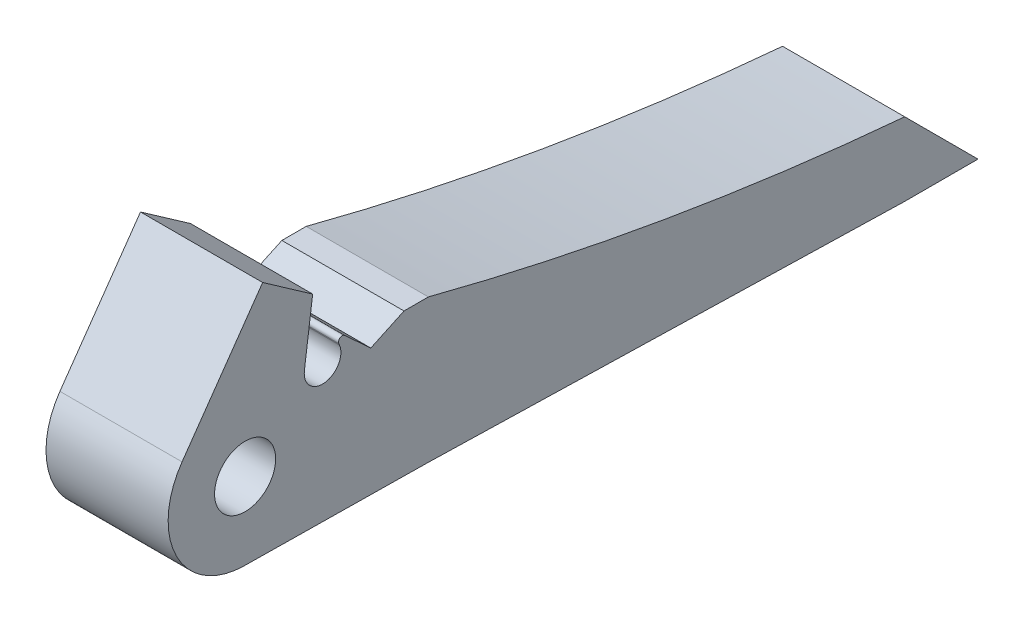
ISO-10303-21;
HEADER;
FILE_DESCRIPTION(('STEP AP214'),'2;1');
FILE_NAME('part.step','',(''),(''),'','','');
FILE_SCHEMA(('AUTOMOTIVE_DESIGN { 1 0 10303 214 1 1 1 1 }'));
ENDSEC;
DATA;
#1=APPLICATION_CONTEXT('core data for automotive mechanical design processes');
#2=APPLICATION_PROTOCOL_DEFINITION('international standard','automotive_design',2000,#1);
#3=PRODUCT_CONTEXT('',#1,'mechanical');
#4=PRODUCT('Part','Part','',(#3));
#5=PRODUCT_RELATED_PRODUCT_CATEGORY('part','',(#4));
#6=PRODUCT_DEFINITION_FORMATION('','',#4);
#7=PRODUCT_DEFINITION_CONTEXT('part definition',#1,'design');
#8=PRODUCT_DEFINITION('design','',#6,#7);
#9=PRODUCT_DEFINITION_SHAPE('','',#8);
#10=(LENGTH_UNIT() NAMED_UNIT(*) SI_UNIT(.MILLI.,.METRE.));
#11=(NAMED_UNIT(*) PLANE_ANGLE_UNIT() SI_UNIT($,.RADIAN.));
#12=(NAMED_UNIT(*) SI_UNIT($,.STERADIAN.) SOLID_ANGLE_UNIT());
#13=UNCERTAINTY_MEASURE_WITH_UNIT(LENGTH_MEASURE(1.E-05),#10,'distance_accuracy_value','');
#14=(GEOMETRIC_REPRESENTATION_CONTEXT(3) GLOBAL_UNCERTAINTY_ASSIGNED_CONTEXT((#13)) GLOBAL_UNIT_ASSIGNED_CONTEXT((#10,
#11,#12)) REPRESENTATION_CONTEXT('',''));
#15=CARTESIAN_POINT('',(0.,0.,0.));
#16=DIRECTION('',(0.,0.,1.));
#17=DIRECTION('',(1.,0.,0.));
#18=AXIS2_PLACEMENT_3D('',#15,#16,#17);
#19=CARTESIAN_POINT('',(6.35,9.525,-176.47164647412));
#20=DIRECTION('',(1.,0.,0.));
#21=DIRECTION('',(0.,0.,-1.));
#22=AXIS2_PLACEMENT_3D('',#19,#20,#21);
#23=PLANE('',#22);
#24=DIRECTION('',(0.,0.675997213115525,0.736904178207753));
#25=VECTOR('',#24,1.);
#26=CARTESIAN_POINT('',(6.35,14.5548502284291,-189.540378321137));
#27=LINE('',#26,#25);
#28=CARTESIAN_POINT('',(6.35,14.5548502284291,-189.540378321137));
#29=VERTEX_POINT('',#28);
#30=CARTESIAN_POINT('',(6.35,17.0473052344059,-186.823354534258));
#31=VERTEX_POINT('',#30);
#32=EDGE_CURVE('E200',#29,#31,#27,.T.);
#33=ORIENTED_EDGE('',*,*,#32,.T.);
#34=CARTESIAN_POINT('',(6.35,16.7665447425088,-186.565799596061));
#35=DIRECTION('',(1.,0.,0.));
#36=DIRECTION('',(0.,0.,-1.));
#37=AXIS2_PLACEMENT_3D('',#34,#35,#36);
#38=CIRCLE('',#37,0.381);
#39=CARTESIAN_POINT('',(6.35,16.6212011416768,-186.213611808514));
#40=VERTEX_POINT('',#39);
#41=EDGE_CURVE('E11',#31,#40,#38,.T.);
#42=ORIENTED_EDGE('',*,*,#41,.T.);
#43=DIRECTION('',(0.,-0.924377395136282,-0.381479267275513));
#44=VECTOR('',#43,1.);
#45=CARTESIAN_POINT('',(6.35,18.206999928397,-185.559172006775));
#46=LINE('',#45,#44);
#47=CARTESIAN_POINT('',(6.35,16.4460609906623,-186.285890010935));
#48=VERTEX_POINT('',#47);
#49=EDGE_CURVE('E202',#40,#48,#46,.T.);
#50=ORIENTED_EDGE('',*,*,#49,.T.);
#51=CARTESIAN_POINT('',(6.35,15.7193429865025,-184.524951073201));
#52=DIRECTION('',(-1.,0.,0.));
#53=DIRECTION('',(0.,0.,1.));
#54=AXIS2_PLACEMENT_3D('',#51,#52,#53);
#55=CIRCLE('',#54,1.905);
#56=CARTESIAN_POINT('',(6.35,15.9704562023799,-182.636574216529));
#57=VERTEX_POINT('',#56);
#58=EDGE_CURVE('E204',#48,#57,#55,.T.);
#59=ORIENTED_EDGE('',*,*,#58,.T.);
#60=DIRECTION('',(0.,0.991273940509862,-0.131817961090479));
#61=VECTOR('',#60,1.);
#62=CARTESIAN_POINT('',(6.35,15.9704562023799,-182.636574216529));
#63=LINE('',#62,#61);
#64=CARTESIAN_POINT('',(6.35,22.4356903032563,-183.496310301906));
#65=VERTEX_POINT('',#64);
#66=EDGE_CURVE('E206',#57,#65,#63,.T.);
#67=ORIENTED_EDGE('',*,*,#66,.T.);
#68=DIRECTION('',(0.,0.573576436351047,0.819152044288991));
#69=VECTOR('',#68,1.);
#70=CARTESIAN_POINT('',(6.35,26.0779006740854,-178.294694820671));
#71=LINE('',#70,#69);
#72=CARTESIAN_POINT('',(6.35,26.0779006740854,-178.294694820671));
#73=VERTEX_POINT('',#72);
#74=EDGE_CURVE('E208',#65,#73,#71,.T.);
#75=ORIENTED_EDGE('',*,*,#74,.T.);
#76=DIRECTION('',(0.,-0.819152044288991,0.573576436351048));
#77=VECTOR('',#76,1.);
#78=CARTESIAN_POINT('',(6.35,14.1141850672447,-169.917610967764));
#79=LINE('',#78,#77);
#80=CARTESIAN_POINT('',(6.35,14.1141850672447,-169.917610967764));
#81=VERTEX_POINT('',#80);
#82=EDGE_CURVE('E210',#73,#81,#79,.T.);
#83=ORIENTED_EDGE('',*,*,#82,.T.);
#84=CARTESIAN_POINT('',(6.35,9.525,-176.47164647412));
#85=DIRECTION('',(1.,0.,0.));
#86=DIRECTION('',(0.,0.,-1.));
#87=AXIS2_PLACEMENT_3D('',#84,#85,#86);
#88=CIRCLE('',#87,8.00100000000001);
#89=CARTESIAN_POINT('',(6.35,1.52470715135464,-176.365272906379));
#90=VERTEX_POINT('',#89);
#91=EDGE_CURVE('E192',#81,#90,#88,.T.);
#92=ORIENTED_EDGE('',*,*,#91,.T.);
#93=DIRECTION('',(0.,-0.0132950340883751,-0.999911617128528));
#94=VECTOR('',#93,1.);
#95=CARTESIAN_POINT('',(6.35,1.27000000001228,-195.521646474134));
#96=LINE('',#95,#94);
#97=CARTESIAN_POINT('',(6.35,1.27000000001228,-195.521646474134));
#98=VERTEX_POINT('',#97);
#99=EDGE_CURVE('E172',#90,#98,#96,.T.);
#100=ORIENTED_EDGE('',*,*,#99,.T.);
#101=DIRECTION('',(0.,-0.0256326007925578,-0.999671430909481));
#102=VECTOR('',#101,1.);
#103=CARTESIAN_POINT('',(6.35,1.27000000001228,-195.521646474134));
#104=LINE('',#103,#102);
#105=CARTESIAN_POINT('',(6.35,1.22757706777499E-11,-245.051646474121));
#106=VERTEX_POINT('',#105);
#107=EDGE_CURVE('E154',#98,#106,#104,.T.);
#108=ORIENTED_EDGE('',*,*,#107,.T.);
#109=DIRECTION('',(0.,0.,-1.));
#110=VECTOR('',#109,1.);
#111=CARTESIAN_POINT('',(6.35,1.22757706777499E-11,-245.051646474121));
#112=LINE('',#111,#110);
#113=CARTESIAN_POINT('',(6.35,1.22755538373154E-11,-252.67164647412));
#114=VERTEX_POINT('',#113);
#115=EDGE_CURVE('E163',#106,#114,#112,.T.);
#116=ORIENTED_EDGE('',*,*,#115,.T.);
#117=DIRECTION('',(0.,0.707106781186549,0.707106781186546));
#118=VECTOR('',#117,1.);
#119=CARTESIAN_POINT('',(6.35,7.62000000001227,-245.051646474121));
#120=LINE('',#119,#118);
#121=CARTESIAN_POINT('',(6.35,7.62000000001227,-245.051646474121));
#122=VERTEX_POINT('',#121);
#123=EDGE_CURVE('E160',#114,#122,#120,.T.);
#124=ORIENTED_EDGE('',*,*,#123,.T.);
#125=CARTESIAN_POINT('',(6.35,307.526330887618,-271.290050546441));
#126=DIRECTION('',(-1.,0.,0.));
#127=DIRECTION('',(0.,0.,-1.));
#128=AXIS2_PLACEMENT_3D('',#125,#126,#127);
#129=CIRCLE('',#128,301.051924349818);
#130=CARTESIAN_POINT('',(6.35,16.1650258056597,-195.52164647412));
#131=VERTEX_POINT('',#130);
#132=EDGE_CURVE('E174',#122,#131,#129,.T.);
#133=ORIENTED_EDGE('',*,*,#132,.T.);
#134=DIRECTION('',(0.,4.5834151490827E-13,1.));
#135=VECTOR('',#134,1.);
#136=CARTESIAN_POINT('',(6.35,16.1650258056608,-192.993410989747));
#137=LINE('',#136,#135);
#138=CARTESIAN_POINT('',(6.35,16.1650258056608,-192.993410989747));
#139=VERTEX_POINT('',#138);
#140=EDGE_CURVE('E196',#131,#139,#137,.T.);
#141=ORIENTED_EDGE('',*,*,#140,.T.);
#142=DIRECTION('',(0.,-0.422618261740703,0.906307787036648));
#143=VECTOR('',#142,1.);
#144=CARTESIAN_POINT('',(6.35,14.8232128246341,-190.115883765906));
#145=LINE('',#144,#143);
#146=EDGE_CURVE('E198',#139,#29,#145,.T.);
#147=ORIENTED_EDGE('',*,*,#146,.T.);
#148=EDGE_LOOP('',(#33,#42,#50,#59,#67,#75,#83,#92,#100,#108,#116,#124,#133,#141,#147));
#149=FACE_BOUND('',#148,.T.);
#150=CARTESIAN_POINT('',(6.35,9.525,-176.47164647412));
#151=DIRECTION('',(1.,0.,0.));
#152=DIRECTION('',(0.,0.,-1.));
#153=AXIS2_PLACEMENT_3D('',#150,#151,#152);
#154=CIRCLE('',#153,3.17499999999995);
#155=CARTESIAN_POINT('',(6.35,9.525,-179.64664647412));
#156=VERTEX_POINT('',#155);
#157=EDGE_CURVE('E184',#156,#156,#154,.T.);
#158=ORIENTED_EDGE('',*,*,#157,.F.);
#159=EDGE_LOOP('',(#158));
#160=FACE_BOUND('',#159,.T.);
#161=ADVANCED_FACE('F41',(#149,#160),#23,.T.);
#162=CARTESIAN_POINT('',(-6.35,9.525,-176.47164647412));
#163=DIRECTION('',(1.,0.,0.));
#164=DIRECTION('',(0.,0.,-1.));
#165=AXIS2_PLACEMENT_3D('',#162,#163,#164);
#166=PLANE('',#165);
#167=DIRECTION('',(0.,-0.924377395136282,-0.381479267275513));
#168=VECTOR('',#167,1.);
#169=CARTESIAN_POINT('',(-6.35,18.206999928397,-185.559172006775));
#170=LINE('',#169,#168);
#171=CARTESIAN_POINT('',(-6.35,16.6212011416768,-186.213611808514));
#172=VERTEX_POINT('',#171);
#173=CARTESIAN_POINT('',(-6.35,16.4460609906623,-186.285890010935));
#174=VERTEX_POINT('',#173);
#175=EDGE_CURVE('E224',#172,#174,#170,.T.);
#176=ORIENTED_EDGE('',*,*,#175,.F.);
#177=CARTESIAN_POINT('',(-6.35,16.7665447425088,-186.565799596061));
#178=DIRECTION('',(1.,0.,0.));
#179=DIRECTION('',(0.,0.,-1.));
#180=AXIS2_PLACEMENT_3D('',#177,#178,#179);
#181=CIRCLE('',#180,0.381);
#182=CARTESIAN_POINT('',(-6.35,17.0473052344059,-186.823354534258));
#183=VERTEX_POINT('',#182);
#184=EDGE_CURVE('E63',#172,#183,#181,.F.);
#185=ORIENTED_EDGE('',*,*,#184,.T.);
#186=DIRECTION('',(0.,0.675997213115525,0.736904178207753));
#187=VECTOR('',#186,1.);
#188=CARTESIAN_POINT('',(-6.35,14.5548502284291,-189.540378321137));
#189=LINE('',#188,#187);
#190=CARTESIAN_POINT('',(-6.35,14.5548502284291,-189.540378321137));
#191=VERTEX_POINT('',#190);
#192=EDGE_CURVE('E222',#191,#183,#189,.T.);
#193=ORIENTED_EDGE('',*,*,#192,.F.);
#194=DIRECTION('',(0.,-0.422618261740214,0.906307787036876));
#195=VECTOR('',#194,1.);
#196=CARTESIAN_POINT('',(-6.35,14.5548502284291,-189.540378321137));
#197=LINE('',#196,#195);
#198=CARTESIAN_POINT('',(-6.35,16.1650258056608,-192.993410989747));
#199=VERTEX_POINT('',#198);
#200=EDGE_CURVE('E220',#199,#191,#197,.T.);
#201=ORIENTED_EDGE('',*,*,#200,.F.);
#202=DIRECTION('',(0.,4.5834151490827E-13,1.));
#203=VECTOR('',#202,1.);
#204=CARTESIAN_POINT('',(-6.35,16.1650258056608,-192.993410989747));
#205=LINE('',#204,#203);
#206=CARTESIAN_POINT('',(-6.35,16.1650258056597,-195.52164647412));
#207=VERTEX_POINT('',#206);
#208=EDGE_CURVE('E217',#207,#199,#205,.T.);
#209=ORIENTED_EDGE('',*,*,#208,.F.);
#210=CARTESIAN_POINT('',(-6.35,307.526330887618,-271.290050546441));
#211=DIRECTION('',(1.,0.,0.));
#212=DIRECTION('',(0.,0.,-1.));
#213=AXIS2_PLACEMENT_3D('',#210,#211,#212);
#214=CIRCLE('',#213,301.051924349818);
#215=CARTESIAN_POINT('',(-6.35,7.62000000001227,-245.051646474121));
#216=VERTEX_POINT('',#215);
#217=EDGE_CURVE('E191',#207,#216,#214,.T.);
#218=ORIENTED_EDGE('',*,*,#217,.T.);
#219=DIRECTION('',(0.,-0.707106781186549,-0.707106781186546));
#220=VECTOR('',#219,1.);
#221=CARTESIAN_POINT('',(-6.35,7.62000000001227,-245.051646474121));
#222=LINE('',#221,#220);
#223=CARTESIAN_POINT('',(-6.35,1.22755538373154E-11,-252.67164647412));
#224=VERTEX_POINT('',#223);
#225=EDGE_CURVE('E345',#216,#224,#222,.T.);
#226=ORIENTED_EDGE('',*,*,#225,.T.);
#227=DIRECTION('',(0.,0.,1.));
#228=VECTOR('',#227,1.);
#229=CARTESIAN_POINT('',(-6.35,1.22757706777499E-11,-245.051646474121));
#230=LINE('',#229,#228);
#231=CARTESIAN_POINT('',(-6.35,1.22755538373154E-11,-245.051646474121));
#232=VERTEX_POINT('',#231);
#233=EDGE_CURVE('E343',#224,#232,#230,.T.);
#234=ORIENTED_EDGE('',*,*,#233,.T.);
#235=DIRECTION('',(0.,0.0256326007925578,0.999671430909481));
#236=VECTOR('',#235,1.);
#237=CARTESIAN_POINT('',(-6.35,1.27000000001228,-195.521646474134));
#238=LINE('',#237,#236);
#239=CARTESIAN_POINT('',(-6.35,1.27000000001228,-195.521646474134));
#240=VERTEX_POINT('',#239);
#241=EDGE_CURVE('E156',#232,#240,#238,.T.);
#242=ORIENTED_EDGE('',*,*,#241,.T.);
#243=DIRECTION('',(0.,-0.0132950340883751,-0.999911617128528));
#244=VECTOR('',#243,1.);
#245=CARTESIAN_POINT('',(-6.35,1.27000000001228,-195.521646474134));
#246=LINE('',#245,#244);
#247=CARTESIAN_POINT('',(-6.35,1.52470715135464,-176.365272906379));
#248=VERTEX_POINT('',#247);
#249=EDGE_CURVE('E215',#248,#240,#246,.T.);
#250=ORIENTED_EDGE('',*,*,#249,.F.);
#251=CARTESIAN_POINT('',(-6.35,9.525,-176.47164647412));
#252=DIRECTION('',(1.,0.,0.));
#253=DIRECTION('',(0.,0.,-1.));
#254=AXIS2_PLACEMENT_3D('',#251,#252,#253);
#255=CIRCLE('',#254,8.00100000000001);
#256=CARTESIAN_POINT('',(-6.35,14.1141850672447,-169.917610967764));
#257=VERTEX_POINT('',#256);
#258=EDGE_CURVE('E187',#257,#248,#255,.T.);
#259=ORIENTED_EDGE('',*,*,#258,.F.);
#260=DIRECTION('',(0.,-0.819152044288991,0.573576436351048));
#261=VECTOR('',#260,1.);
#262=CARTESIAN_POINT('',(-6.35,14.1141850672447,-169.917610967764));
#263=LINE('',#262,#261);
#264=CARTESIAN_POINT('',(-6.35,26.0779006740854,-178.294694820671));
#265=VERTEX_POINT('',#264);
#266=EDGE_CURVE('E194',#265,#257,#263,.T.);
#267=ORIENTED_EDGE('',*,*,#266,.F.);
#268=DIRECTION('',(0.,0.573576436351047,0.819152044288991));
#269=VECTOR('',#268,1.);
#270=CARTESIAN_POINT('',(-6.35,26.0779006740854,-178.294694820671));
#271=LINE('',#270,#269);
#272=CARTESIAN_POINT('',(-6.35,22.4356903032563,-183.496310301906));
#273=VERTEX_POINT('',#272);
#274=EDGE_CURVE('E230',#273,#265,#271,.T.);
#275=ORIENTED_EDGE('',*,*,#274,.F.);
#276=DIRECTION('',(0.,0.991273940509862,-0.131817961090479));
#277=VECTOR('',#276,1.);
#278=CARTESIAN_POINT('',(-6.35,15.9704562023799,-182.636574216529));
#279=LINE('',#278,#277);
#280=CARTESIAN_POINT('',(-6.35,15.9704562023799,-182.636574216529));
#281=VERTEX_POINT('',#280);
#282=EDGE_CURVE('E228',#281,#273,#279,.T.);
#283=ORIENTED_EDGE('',*,*,#282,.F.);
#284=CARTESIAN_POINT('',(-6.35,15.7193429865025,-184.524951073201));
#285=DIRECTION('',(-1.,0.,0.));
#286=DIRECTION('',(0.,0.,1.));
#287=AXIS2_PLACEMENT_3D('',#284,#285,#286);
#288=CIRCLE('',#287,1.905);
#289=EDGE_CURVE('E226',#174,#281,#288,.T.);
#290=ORIENTED_EDGE('',*,*,#289,.F.);
#291=EDGE_LOOP('',(#176,#185,#193,#201,#209,#218,#226,#234,#242,#250,#259,#267,#275,#283,#290));
#292=FACE_BOUND('',#291,.T.);
#293=CARTESIAN_POINT('',(-6.35,9.525,-176.47164647412));
#294=DIRECTION('',(1.,0.,0.));
#295=DIRECTION('',(0.,0.,-1.));
#296=AXIS2_PLACEMENT_3D('',#293,#294,#295);
#297=CIRCLE('',#296,3.17499999999995);
#298=CARTESIAN_POINT('',(-6.35,9.525,-179.64664647412));
#299=VERTEX_POINT('',#298);
#300=EDGE_CURVE('E188',#299,#299,#297,.T.);
#301=ORIENTED_EDGE('',*,*,#300,.T.);
#302=EDGE_LOOP('',(#301));
#303=FACE_BOUND('',#302,.T.);
#304=ADVANCED_FACE('F271',(#292,#303),#166,.F.);
#305=CARTESIAN_POINT('',(6.35,9.525,-176.47164647412));
#306=DIRECTION('',(-1.,0.,0.));
#307=DIRECTION('',(0.,0.,1.));
#308=AXIS2_PLACEMENT_3D('',#305,#306,#307);
#309=CYLINDRICAL_SURFACE('',#308,8.00100000000001);
#310=ORIENTED_EDGE('',*,*,#258,.T.);
#311=DIRECTION('',(-1.,0.,0.));
#312=VECTOR('',#311,1.);
#313=CARTESIAN_POINT('',(6.35,1.52470715135464,-176.365272906379));
#314=LINE('',#313,#312);
#315=EDGE_CURVE('E257',#90,#248,#314,.T.);
#316=ORIENTED_EDGE('',*,*,#315,.F.);
#317=ORIENTED_EDGE('',*,*,#91,.F.);
#318=DIRECTION('',(-1.,0.,0.));
#319=VECTOR('',#318,1.);
#320=CARTESIAN_POINT('',(6.35,14.1141850672447,-169.917610967764));
#321=LINE('',#320,#319);
#322=EDGE_CURVE('E212',#81,#257,#321,.T.);
#323=ORIENTED_EDGE('',*,*,#322,.T.);
#324=EDGE_LOOP('',(#310,#316,#317,#323));
#325=FACE_BOUND('',#324,.T.);
#326=ADVANCED_FACE('F303',(#325),#309,.T.);
#327=CARTESIAN_POINT('',(6.35,1.27000000001228,-195.521646474134));
#328=DIRECTION('',(0.,0.999911617128528,-0.0132950340883751));
#329=DIRECTION('',(0.,0.0132950340883751,0.999911617128528));
#330=AXIS2_PLACEMENT_3D('',#327,#328,#329);
#331=PLANE('',#330);
#332=ORIENTED_EDGE('',*,*,#249,.T.);
#333=DIRECTION('',(-1.,0.,0.));
#334=VECTOR('',#333,1.);
#335=CARTESIAN_POINT('',(6.35,1.27000000001228,-195.521646474134));
#336=LINE('',#335,#334);
#337=EDGE_CURVE('E255',#98,#240,#336,.T.);
#338=ORIENTED_EDGE('',*,*,#337,.F.);
#339=ORIENTED_EDGE('',*,*,#99,.F.);
#340=ORIENTED_EDGE('',*,*,#315,.T.);
#341=EDGE_LOOP('',(#332,#338,#339,#340));
#342=FACE_BOUND('',#341,.T.);
#343=ADVANCED_FACE('F329',(#342),#331,.F.);
#344=CARTESIAN_POINT('',(6.35,16.1650258056608,-192.993410989747));
#345=DIRECTION('',(0.,-1.,4.5834151490827E-13));
#346=DIRECTION('',(0.,-4.5834151490827E-13,-1.));
#347=AXIS2_PLACEMENT_3D('',#344,#345,#346);
#348=PLANE('',#347);
#349=ORIENTED_EDGE('',*,*,#208,.T.);
#350=DIRECTION('',(-1.,0.,0.));
#351=VECTOR('',#350,1.);
#352=CARTESIAN_POINT('',(6.35,16.1650258056608,-192.993410989747));
#353=LINE('',#352,#351);
#354=EDGE_CURVE('E250',#139,#199,#353,.T.);
#355=ORIENTED_EDGE('',*,*,#354,.F.);
#356=ORIENTED_EDGE('',*,*,#140,.F.);
#357=DIRECTION('',(-1.,0.,0.));
#358=VECTOR('',#357,1.);
#359=CARTESIAN_POINT('',(6.35,16.1650258056597,-195.52164647412));
#360=LINE('',#359,#358);
#361=EDGE_CURVE('E253',#131,#207,#360,.T.);
#362=ORIENTED_EDGE('',*,*,#361,.T.);
#363=EDGE_LOOP('',(#349,#355,#356,#362));
#364=FACE_BOUND('',#363,.T.);
#365=ADVANCED_FACE('F325',(#364),#348,.F.);
#366=CARTESIAN_POINT('',(6.35,14.5548502284291,-189.540378321137));
#367=DIRECTION('',(0.,-0.906307787036876,-0.422618261740214));
#368=DIRECTION('',(0.,0.422618261740214,-0.906307787036876));
#369=AXIS2_PLACEMENT_3D('',#366,#367,#368);
#370=PLANE('',#369);
#371=ORIENTED_EDGE('',*,*,#200,.T.);
#372=DIRECTION('',(-1.,0.,0.));
#373=VECTOR('',#372,1.);
#374=CARTESIAN_POINT('',(6.35,14.5548502284291,-189.540378321137));
#375=LINE('',#374,#373);
#376=EDGE_CURVE('E247',#29,#191,#375,.T.);
#377=ORIENTED_EDGE('',*,*,#376,.F.);
#378=ORIENTED_EDGE('',*,*,#146,.F.);
#379=ORIENTED_EDGE('',*,*,#354,.T.);
#380=EDGE_LOOP('',(#371,#377,#378,#379));
#381=FACE_BOUND('',#380,.T.);
#382=ADVANCED_FACE('F322',(#381),#370,.F.);
#383=CARTESIAN_POINT('',(6.35,14.5548502284291,-189.540378321137));
#384=DIRECTION('',(0.,-0.736904178207753,0.675997213115525));
#385=DIRECTION('',(0.,-0.675997213115525,-0.736904178207753));
#386=AXIS2_PLACEMENT_3D('',#383,#384,#385);
#387=PLANE('',#386);
#388=ORIENTED_EDGE('',*,*,#192,.T.);
#389=DIRECTION('',(-1.,0.,0.));
#390=VECTOR('',#389,1.);
#391=CARTESIAN_POINT('',(6.35,17.0473052344059,-186.823354534258));
#392=LINE('',#391,#390);
#393=EDGE_CURVE('E49',#183,#31,#392,.F.);
#394=ORIENTED_EDGE('',*,*,#393,.T.);
#395=ORIENTED_EDGE('',*,*,#32,.F.);
#396=ORIENTED_EDGE('',*,*,#376,.T.);
#397=EDGE_LOOP('',(#388,#394,#395,#396));
#398=FACE_BOUND('',#397,.T.);
#399=ADVANCED_FACE('F319',(#398),#387,.F.);
#400=CARTESIAN_POINT('',(6.35,18.206999928397,-185.559172006775));
#401=DIRECTION('',(0.,0.381479267275513,-0.924377395136282));
#402=DIRECTION('',(0.,0.924377395136282,0.381479267275513));
#403=AXIS2_PLACEMENT_3D('',#400,#401,#402);
#404=PLANE('',#403);
#405=ORIENTED_EDGE('',*,*,#49,.F.);
#406=DIRECTION('',(-1.,0.,0.));
#407=VECTOR('',#406,1.);
#408=CARTESIAN_POINT('',(6.35,16.6212011416768,-186.213611808514));
#409=LINE('',#408,#407);
#410=EDGE_CURVE('E260',#40,#172,#409,.T.);
#411=ORIENTED_EDGE('',*,*,#410,.T.);
#412=ORIENTED_EDGE('',*,*,#175,.T.);
#413=DIRECTION('',(-1.,0.,0.));
#414=VECTOR('',#413,1.);
#415=CARTESIAN_POINT('',(6.35,16.4460609906623,-186.285890010935));
#416=LINE('',#415,#414);
#417=EDGE_CURVE('E244',#48,#174,#416,.T.);
#418=ORIENTED_EDGE('',*,*,#417,.F.);
#419=EDGE_LOOP('',(#405,#411,#412,#418));
#420=FACE_BOUND('',#419,.T.);
#421=ADVANCED_FACE('F266',(#420),#404,.F.);
#422=CARTESIAN_POINT('',(6.35,15.7193429865025,-184.524951073201));
#423=DIRECTION('',(-1.,0.,0.));
#424=DIRECTION('',(0.,0.,1.));
#425=AXIS2_PLACEMENT_3D('',#422,#423,#424);
#426=CYLINDRICAL_SURFACE('',#425,1.905);
#427=ORIENTED_EDGE('',*,*,#289,.T.);
#428=DIRECTION('',(-1.,0.,0.));
#429=VECTOR('',#428,1.);
#430=CARTESIAN_POINT('',(6.35,15.9704562023799,-182.636574216529));
#431=LINE('',#430,#429);
#432=EDGE_CURVE('E241',#57,#281,#431,.T.);
#433=ORIENTED_EDGE('',*,*,#432,.F.);
#434=ORIENTED_EDGE('',*,*,#58,.F.);
#435=ORIENTED_EDGE('',*,*,#417,.T.);
#436=EDGE_LOOP('',(#427,#433,#434,#435));
#437=FACE_BOUND('',#436,.T.);
#438=ADVANCED_FACE('F277',(#437),#426,.F.);
#439=CARTESIAN_POINT('',(6.35,15.9704562023799,-182.636574216529));
#440=DIRECTION('',(0.,0.131817961090479,0.991273940509862));
#441=DIRECTION('',(0.,-0.991273940509862,0.131817961090479));
#442=AXIS2_PLACEMENT_3D('',#439,#440,#441);
#443=PLANE('',#442);
#444=ORIENTED_EDGE('',*,*,#282,.T.);
#445=DIRECTION('',(-1.,0.,0.));
#446=VECTOR('',#445,1.);
#447=CARTESIAN_POINT('',(6.35,22.4356903032563,-183.496310301906));
#448=LINE('',#447,#446);
#449=EDGE_CURVE('E238',#65,#273,#448,.T.);
#450=ORIENTED_EDGE('',*,*,#449,.F.);
#451=ORIENTED_EDGE('',*,*,#66,.F.);
#452=ORIENTED_EDGE('',*,*,#432,.T.);
#453=EDGE_LOOP('',(#444,#450,#451,#452));
#454=FACE_BOUND('',#453,.T.);
#455=ADVANCED_FACE('F281',(#454),#443,.F.);
#456=CARTESIAN_POINT('',(6.35,26.0779006740854,-178.294694820671));
#457=DIRECTION('',(0.,-0.819152044288991,0.573576436351047));
#458=DIRECTION('',(0.,-0.573576436351047,-0.819152044288991));
#459=AXIS2_PLACEMENT_3D('',#456,#457,#458);
#460=PLANE('',#459);
#461=ORIENTED_EDGE('',*,*,#274,.T.);
#462=DIRECTION('',(-1.,0.,0.));
#463=VECTOR('',#462,1.);
#464=CARTESIAN_POINT('',(6.35,26.0779006740854,-178.294694820671));
#465=LINE('',#464,#463);
#466=EDGE_CURVE('E235',#73,#265,#465,.T.);
#467=ORIENTED_EDGE('',*,*,#466,.F.);
#468=ORIENTED_EDGE('',*,*,#74,.F.);
#469=ORIENTED_EDGE('',*,*,#449,.T.);
#470=EDGE_LOOP('',(#461,#467,#468,#469));
#471=FACE_BOUND('',#470,.T.);
#472=ADVANCED_FACE('F308',(#471),#460,.F.);
#473=CARTESIAN_POINT('',(6.35,14.1141850672447,-169.917610967764));
#474=DIRECTION('',(0.,-0.573576436351048,-0.819152044288991));
#475=DIRECTION('',(0.,0.819152044288991,-0.573576436351048));
#476=AXIS2_PLACEMENT_3D('',#473,#474,#475);
#477=PLANE('',#476);
#478=ORIENTED_EDGE('',*,*,#266,.T.);
#479=ORIENTED_EDGE('',*,*,#322,.F.);
#480=ORIENTED_EDGE('',*,*,#82,.F.);
#481=ORIENTED_EDGE('',*,*,#466,.T.);
#482=EDGE_LOOP('',(#478,#479,#480,#481));
#483=FACE_BOUND('',#482,.T.);
#484=ADVANCED_FACE('F295',(#483),#477,.F.);
#485=CARTESIAN_POINT('',(6.35,9.525,-176.47164647412));
#486=DIRECTION('',(-1.,0.,0.));
#487=DIRECTION('',(0.,0.,1.));
#488=AXIS2_PLACEMENT_3D('',#485,#486,#487);
#489=CYLINDRICAL_SURFACE('',#488,3.17499999999995);
#490=ORIENTED_EDGE('',*,*,#157,.T.);
#491=EDGE_LOOP('',(#490));
#492=FACE_BOUND('',#491,.T.);
#493=ORIENTED_EDGE('',*,*,#300,.F.);
#494=EDGE_LOOP('',(#493));
#495=FACE_BOUND('',#494,.T.);
#496=ADVANCED_FACE('F287',(#492,#495),#489,.F.);
#497=CARTESIAN_POINT('',(6.35,16.7665447425088,-186.565799596061));
#498=DIRECTION('',(-1.,0.,0.));
#499=DIRECTION('',(0.,0.,1.));
#500=AXIS2_PLACEMENT_3D('',#497,#498,#499);
#501=CYLINDRICAL_SURFACE('',#500,0.381);
#502=ORIENTED_EDGE('',*,*,#41,.F.);
#503=ORIENTED_EDGE('',*,*,#393,.F.);
#504=ORIENTED_EDGE('',*,*,#184,.F.);
#505=ORIENTED_EDGE('',*,*,#410,.F.);
#506=EDGE_LOOP('',(#502,#503,#504,#505));
#507=FACE_BOUND('',#506,.T.);
#508=ADVANCED_FACE('F43',(#507),#501,.T.);
#509=CARTESIAN_POINT('',(-65.7421759097716,307.526330887618,-271.290050546441));
#510=DIRECTION('',(1.,0.,0.));
#511=DIRECTION('',(0.,0.,-1.));
#512=AXIS2_PLACEMENT_3D('',#509,#510,#511);
#513=CYLINDRICAL_SURFACE('',#512,301.051924349818);
#514=ORIENTED_EDGE('',*,*,#217,.F.);
#515=ORIENTED_EDGE('',*,*,#361,.F.);
#516=ORIENTED_EDGE('',*,*,#132,.F.);
#517=DIRECTION('',(1.,0.,0.));
#518=VECTOR('',#517,1.);
#519=CARTESIAN_POINT('',(-65.7421759097716,7.62000000001227,-245.051646474121));
#520=LINE('',#519,#518);
#521=EDGE_CURVE('E181',#216,#122,#520,.T.);
#522=ORIENTED_EDGE('',*,*,#521,.F.);
#523=EDGE_LOOP('',(#514,#515,#516,#522));
#524=FACE_BOUND('',#523,.T.);
#525=ADVANCED_FACE('F286',(#524),#513,.F.);
#526=CARTESIAN_POINT('',(-65.7421759097716,7.62000000001227,-245.051646474121));
#527=DIRECTION('',(0.,0.707106781186546,-0.707106781186549));
#528=DIRECTION('',(0.,0.707106781186549,0.707106781186546));
#529=AXIS2_PLACEMENT_3D('',#526,#527,#528);
#530=PLANE('',#529);
#531=ORIENTED_EDGE('',*,*,#225,.F.);
#532=ORIENTED_EDGE('',*,*,#521,.T.);
#533=ORIENTED_EDGE('',*,*,#123,.F.);
#534=DIRECTION('',(1.,0.,0.));
#535=VECTOR('',#534,1.);
#536=CARTESIAN_POINT('',(-65.7421759097716,1.22755538373154E-11,-252.67164647412));
#537=LINE('',#536,#535);
#538=EDGE_CURVE('E159',#224,#114,#537,.T.);
#539=ORIENTED_EDGE('',*,*,#538,.F.);
#540=EDGE_LOOP('',(#531,#532,#533,#539));
#541=FACE_BOUND('',#540,.T.);
#542=ADVANCED_FACE('F292',(#541),#530,.T.);
#543=CARTESIAN_POINT('',(-65.7421759097716,1.22757706777499E-11,-245.051646474121));
#544=DIRECTION('',(0.,-1.,0.));
#545=DIRECTION('',(0.,0.,-1.));
#546=AXIS2_PLACEMENT_3D('',#543,#544,#545);
#547=PLANE('',#546);
#548=ORIENTED_EDGE('',*,*,#233,.F.);
#549=ORIENTED_EDGE('',*,*,#538,.T.);
#550=ORIENTED_EDGE('',*,*,#115,.F.);
#551=DIRECTION('',(1.,0.,0.));
#552=VECTOR('',#551,1.);
#553=CARTESIAN_POINT('',(-65.7421759097716,1.22757706777499E-11,-245.051646474121));
#554=LINE('',#553,#552);
#555=EDGE_CURVE('E149',#232,#106,#554,.T.);
#556=ORIENTED_EDGE('',*,*,#555,.F.);
#557=EDGE_LOOP('',(#548,#549,#550,#556));
#558=FACE_BOUND('',#557,.T.);
#559=ADVANCED_FACE('F164',(#558),#547,.T.);
#560=CARTESIAN_POINT('',(-65.7421759097716,1.27000000001228,-195.521646474134));
#561=DIRECTION('',(0.,-0.999671430909481,0.0256326007925578));
#562=DIRECTION('',(0.,-0.0256326007925578,-0.999671430909481));
#563=AXIS2_PLACEMENT_3D('',#560,#561,#562);
#564=PLANE('',#563);
#565=ORIENTED_EDGE('',*,*,#241,.F.);
#566=ORIENTED_EDGE('',*,*,#555,.T.);
#567=ORIENTED_EDGE('',*,*,#107,.F.);
#568=ORIENTED_EDGE('',*,*,#337,.T.);
#569=EDGE_LOOP('',(#565,#566,#567,#568));
#570=FACE_BOUND('',#569,.T.);
#571=ADVANCED_FACE('F151',(#570),#564,.T.);
#572=CLOSED_SHELL('',(#161,#304,#326,#343,#365,#382,#399,#421,#438,#455,#472,#484,#496,#508,
#525,#542,#559,#571));
#573=MANIFOLD_SOLID_BREP('B2',#572);
#574=ADVANCED_BREP_SHAPE_REPRESENTATION('',(#18,#573),#14);
#575=SHAPE_DEFINITION_REPRESENTATION(#9,#574);
ENDSEC;
END-ISO-10303-21;
